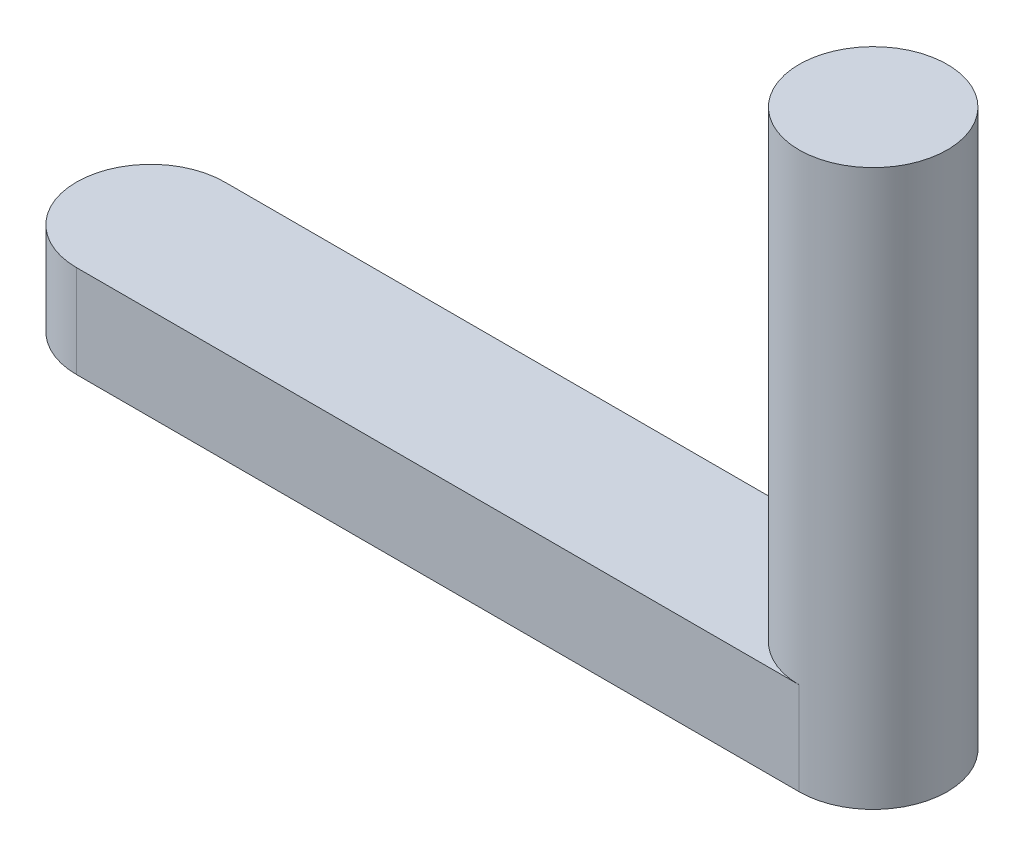
ISO-10303-21;
HEADER;
FILE_DESCRIPTION(('STEP AP214'),'2;1');
FILE_NAME('part.step','',(''),(''),'','','');
FILE_SCHEMA(('AUTOMOTIVE_DESIGN { 1 0 10303 214 1 1 1 1 }'));
ENDSEC;
DATA;
#1=APPLICATION_CONTEXT('core data for automotive mechanical design processes');
#2=APPLICATION_PROTOCOL_DEFINITION('international standard','automotive_design',2000,#1);
#3=PRODUCT_CONTEXT('',#1,'mechanical');
#4=PRODUCT('Part','Part','',(#3));
#5=PRODUCT_RELATED_PRODUCT_CATEGORY('part','',(#4));
#6=PRODUCT_DEFINITION_FORMATION('','',#4);
#7=PRODUCT_DEFINITION_CONTEXT('part definition',#1,'design');
#8=PRODUCT_DEFINITION('design','',#6,#7);
#9=PRODUCT_DEFINITION_SHAPE('','',#8);
#10=(LENGTH_UNIT() NAMED_UNIT(*) SI_UNIT(.MILLI.,.METRE.));
#11=(NAMED_UNIT(*) PLANE_ANGLE_UNIT() SI_UNIT($,.RADIAN.));
#12=(NAMED_UNIT(*) SI_UNIT($,.STERADIAN.) SOLID_ANGLE_UNIT());
#13=UNCERTAINTY_MEASURE_WITH_UNIT(LENGTH_MEASURE(1.E-05),#10,'distance_accuracy_value','');
#14=(GEOMETRIC_REPRESENTATION_CONTEXT(3) GLOBAL_UNCERTAINTY_ASSIGNED_CONTEXT((#13)) GLOBAL_UNIT_ASSIGNED_CONTEXT((#10,
#11,#12)) REPRESENTATION_CONTEXT('',''));
#15=CARTESIAN_POINT('',(0.,0.,0.));
#16=DIRECTION('',(0.,0.,1.));
#17=DIRECTION('',(1.,0.,0.));
#18=AXIS2_PLACEMENT_3D('',#15,#16,#17);
#19=CARTESIAN_POINT('',(0.,5.,4.));
#20=DIRECTION('',(0.,1.,0.));
#21=DIRECTION('',(0.,0.,1.));
#22=AXIS2_PLACEMENT_3D('',#19,#20,#21);
#23=PLANE('',#22);
#24=DIRECTION('',(1.,0.,0.));
#25=VECTOR('',#24,1.);
#26=CARTESIAN_POINT('',(1.81795211913818E-07,5.,8.));
#27=LINE('',#26,#25);
#28=CARTESIAN_POINT('',(1.81795211913818E-07,5.,8.));
#29=VERTEX_POINT('',#28);
#30=CARTESIAN_POINT('',(39.0000001817957,5.,8.));
#31=VERTEX_POINT('',#30);
#32=EDGE_CURVE('E92',#29,#31,#27,.T.);
#33=ORIENTED_EDGE('',*,*,#32,.T.);
#34=CARTESIAN_POINT('',(39.0000001817957,5.,4.));
#35=DIRECTION('',(0.,1.,0.));
#36=DIRECTION('',(0.,0.,1.));
#37=AXIS2_PLACEMENT_3D('',#34,#35,#36);
#38=CIRCLE('',#37,4.00000000000001);
#39=CARTESIAN_POINT('',(39.0000000000004,5.,0.));
#40=VERTEX_POINT('',#39);
#41=EDGE_CURVE('E103',#31,#40,#38,.F.);
#42=ORIENTED_EDGE('',*,*,#41,.T.);
#43=DIRECTION('',(-1.,0.,0.));
#44=VECTOR('',#43,1.);
#45=CARTESIAN_POINT('',(0.,5.,0.));
#46=LINE('',#45,#44);
#47=CARTESIAN_POINT('',(0.,5.,0.));
#48=VERTEX_POINT('',#47);
#49=EDGE_CURVE('E63',#40,#48,#46,.T.);
#50=ORIENTED_EDGE('',*,*,#49,.T.);
#51=CARTESIAN_POINT('',(0.,5.,4.));
#52=DIRECTION('',(0.,1.,0.));
#53=DIRECTION('',(0.,0.,1.));
#54=AXIS2_PLACEMENT_3D('',#51,#52,#53);
#55=CIRCLE('',#54,4.);
#56=EDGE_CURVE('E122',#48,#29,#55,.T.);
#57=ORIENTED_EDGE('',*,*,#56,.T.);
#58=EDGE_LOOP('',(#33,#42,#50,#57));
#59=FACE_BOUND('',#58,.T.);
#60=ADVANCED_FACE('F45',(#59),#23,.T.);
#61=CARTESIAN_POINT('',(0.,5.,4.));
#62=DIRECTION('',(0.,-1.,0.));
#63=DIRECTION('',(0.,0.,-1.));
#64=AXIS2_PLACEMENT_3D('',#61,#62,#63);
#65=CYLINDRICAL_SURFACE('',#64,4.);
#66=CARTESIAN_POINT('',(0.,0.,4.));
#67=DIRECTION('',(0.,1.,0.));
#68=DIRECTION('',(0.,0.,1.));
#69=AXIS2_PLACEMENT_3D('',#66,#67,#68);
#70=CIRCLE('',#69,4.);
#71=CARTESIAN_POINT('',(0.,0.,0.));
#72=VERTEX_POINT('',#71);
#73=CARTESIAN_POINT('',(1.81795211913818E-07,0.,8.));
#74=VERTEX_POINT('',#73);
#75=EDGE_CURVE('E120',#72,#74,#70,.T.);
#76=ORIENTED_EDGE('',*,*,#75,.T.);
#77=DIRECTION('',(0.,-1.,0.));
#78=VECTOR('',#77,1.);
#79=CARTESIAN_POINT('',(1.81795211913818E-07,5.,8.));
#80=LINE('',#79,#78);
#81=EDGE_CURVE('E11',#29,#74,#80,.T.);
#82=ORIENTED_EDGE('',*,*,#81,.F.);
#83=ORIENTED_EDGE('',*,*,#56,.F.);
#84=DIRECTION('',(0.,-1.,0.));
#85=VECTOR('',#84,1.);
#86=CARTESIAN_POINT('',(0.,5.,0.));
#87=LINE('',#86,#85);
#88=EDGE_CURVE('E96',#48,#72,#87,.T.);
#89=ORIENTED_EDGE('',*,*,#88,.T.);
#90=EDGE_LOOP('',(#76,#82,#83,#89));
#91=FACE_BOUND('',#90,.T.);
#92=ADVANCED_FACE('F47',(#91),#65,.T.);
#93=CARTESIAN_POINT('',(1.81795211913818E-07,5.,8.));
#94=DIRECTION('',(0.,0.,-1.));
#95=DIRECTION('',(-1.,0.,0.));
#96=AXIS2_PLACEMENT_3D('',#93,#94,#95);
#97=PLANE('',#96);
#98=DIRECTION('',(1.,0.,0.));
#99=VECTOR('',#98,1.);
#100=CARTESIAN_POINT('',(1.81795211913818E-07,0.,8.));
#101=LINE('',#100,#99);
#102=CARTESIAN_POINT('',(39.0000001817957,0.,8.));
#103=VERTEX_POINT('',#102);
#104=EDGE_CURVE('E130',#74,#103,#101,.T.);
#105=ORIENTED_EDGE('',*,*,#104,.T.);
#106=DIRECTION('',(0.,-1.,0.));
#107=VECTOR('',#106,1.);
#108=CARTESIAN_POINT('',(39.0000001817957,5.,8.));
#109=LINE('',#108,#107);
#110=EDGE_CURVE('E55',#31,#103,#109,.T.);
#111=ORIENTED_EDGE('',*,*,#110,.F.);
#112=ORIENTED_EDGE('',*,*,#32,.F.);
#113=ORIENTED_EDGE('',*,*,#81,.T.);
#114=EDGE_LOOP('',(#105,#111,#112,#113));
#115=FACE_BOUND('',#114,.T.);
#116=ADVANCED_FACE('F145',(#115),#97,.F.);
#117=CARTESIAN_POINT('',(39.0000001817957,5.,4.));
#118=DIRECTION('',(0.,-1.,0.));
#119=DIRECTION('',(0.,0.,-1.));
#120=AXIS2_PLACEMENT_3D('',#117,#118,#119);
#121=CYLINDRICAL_SURFACE('',#120,4.);
#122=CARTESIAN_POINT('',(39.0000001817957,0.,4.));
#123=DIRECTION('',(0.,1.,0.));
#124=DIRECTION('',(0.,0.,1.));
#125=AXIS2_PLACEMENT_3D('',#122,#123,#124);
#126=CIRCLE('',#125,4.);
#127=CARTESIAN_POINT('',(39.0000000000004,0.,0.));
#128=VERTEX_POINT('',#127);
#129=EDGE_CURVE('E82',#103,#128,#126,.T.);
#130=ORIENTED_EDGE('',*,*,#129,.T.);
#131=DIRECTION('',(0.,-1.,0.));
#132=VECTOR('',#131,1.);
#133=CARTESIAN_POINT('',(39.0000000000004,5.,0.));
#134=LINE('',#133,#132);
#135=EDGE_CURVE('E95',#40,#128,#134,.T.);
#136=ORIENTED_EDGE('',*,*,#135,.F.);
#137=ORIENTED_EDGE('',*,*,#41,.F.);
#138=ORIENTED_EDGE('',*,*,#110,.T.);
#139=EDGE_LOOP('',(#130,#136,#137,#138));
#140=FACE_BOUND('',#139,.T.);
#141=CARTESIAN_POINT('',(39.0000001817957,30.,4.));
#142=DIRECTION('',(0.,1.,0.));
#143=DIRECTION('',(0.,0.,1.));
#144=AXIS2_PLACEMENT_3D('',#141,#142,#143);
#145=CIRCLE('',#144,4.00000000000001);
#146=CARTESIAN_POINT('',(39.0000001817957,30.,8.00000000000001));
#147=VERTEX_POINT('',#146);
#148=EDGE_CURVE('E108',#147,#147,#145,.T.);
#149=ORIENTED_EDGE('',*,*,#148,.F.);
#150=EDGE_LOOP('',(#149));
#151=FACE_BOUND('',#150,.T.);
#152=ADVANCED_FACE('F101',(#140,#151),#121,.T.);
#153=CARTESIAN_POINT('',(0.,5.,0.));
#154=DIRECTION('',(0.,0.,1.));
#155=DIRECTION('',(1.,0.,0.));
#156=AXIS2_PLACEMENT_3D('',#153,#154,#155);
#157=PLANE('',#156);
#158=DIRECTION('',(-1.,0.,0.));
#159=VECTOR('',#158,1.);
#160=CARTESIAN_POINT('',(0.,0.,0.));
#161=LINE('',#160,#159);
#162=EDGE_CURVE('E87',#128,#72,#161,.T.);
#163=ORIENTED_EDGE('',*,*,#162,.T.);
#164=ORIENTED_EDGE('',*,*,#88,.F.);
#165=ORIENTED_EDGE('',*,*,#49,.F.);
#166=ORIENTED_EDGE('',*,*,#135,.T.);
#167=EDGE_LOOP('',(#163,#164,#165,#166));
#168=FACE_BOUND('',#167,.T.);
#169=ADVANCED_FACE('F94',(#168),#157,.F.);
#170=CARTESIAN_POINT('',(0.,0.,4.));
#171=DIRECTION('',(0.,1.,0.));
#172=DIRECTION('',(0.,0.,1.));
#173=AXIS2_PLACEMENT_3D('',#170,#171,#172);
#174=PLANE('',#173);
#175=ORIENTED_EDGE('',*,*,#129,.F.);
#176=ORIENTED_EDGE('',*,*,#104,.F.);
#177=ORIENTED_EDGE('',*,*,#75,.F.);
#178=ORIENTED_EDGE('',*,*,#162,.F.);
#179=EDGE_LOOP('',(#175,#176,#177,#178));
#180=FACE_BOUND('',#179,.T.);
#181=CARTESIAN_POINT('',(0.,0.,4.));
#182=DIRECTION('',(0.,1.,0.));
#183=DIRECTION('',(0.,0.,1.));
#184=AXIS2_PLACEMENT_3D('',#181,#182,#183);
#185=CIRCLE('',#184,2.525);
#186=CARTESIAN_POINT('',(0.,0.,6.525));
#187=VERTEX_POINT('',#186);
#188=EDGE_CURVE('E107',#187,#187,#185,.T.);
#189=ORIENTED_EDGE('',*,*,#188,.T.);
#190=EDGE_LOOP('',(#189));
#191=FACE_BOUND('',#190,.T.);
#192=ADVANCED_FACE('F140',(#180,#191),#174,.F.);
#193=CARTESIAN_POINT('',(0.,2.,4.));
#194=DIRECTION('',(0.,-1.,0.));
#195=DIRECTION('',(0.,0.,-1.));
#196=AXIS2_PLACEMENT_3D('',#193,#194,#195);
#197=CYLINDRICAL_SURFACE('',#196,2.525);
#198=CARTESIAN_POINT('',(0.,2.,4.));
#199=DIRECTION('',(0.,1.,0.));
#200=DIRECTION('',(0.,0.,1.));
#201=AXIS2_PLACEMENT_3D('',#198,#199,#200);
#202=CIRCLE('',#201,2.525);
#203=CARTESIAN_POINT('',(0.,2.,6.525));
#204=VERTEX_POINT('',#203);
#205=EDGE_CURVE('E113',#204,#204,#202,.T.);
#206=ORIENTED_EDGE('',*,*,#205,.T.);
#207=EDGE_LOOP('',(#206));
#208=FACE_BOUND('',#207,.T.);
#209=ORIENTED_EDGE('',*,*,#188,.F.);
#210=EDGE_LOOP('',(#209));
#211=FACE_BOUND('',#210,.T.);
#212=ADVANCED_FACE('F159',(#208,#211),#197,.F.);
#213=CARTESIAN_POINT('',(0.,2.,4.));
#214=DIRECTION('',(0.,1.,0.));
#215=DIRECTION('',(0.,0.,1.));
#216=AXIS2_PLACEMENT_3D('',#213,#214,#215);
#217=PLANE('',#216);
#218=ORIENTED_EDGE('',*,*,#205,.F.);
#219=EDGE_LOOP('',(#218));
#220=FACE_BOUND('',#219,.T.);
#221=ADVANCED_FACE('F176',(#220),#217,.F.);
#222=CARTESIAN_POINT('',(39.0000001817957,30.,4.));
#223=DIRECTION('',(0.,1.,0.));
#224=DIRECTION('',(0.,0.,1.));
#225=AXIS2_PLACEMENT_3D('',#222,#223,#224);
#226=PLANE('',#225);
#227=ORIENTED_EDGE('',*,*,#148,.T.);
#228=EDGE_LOOP('',(#227));
#229=FACE_BOUND('',#228,.T.);
#230=ADVANCED_FACE('F183',(#229),#226,.T.);
#231=CLOSED_SHELL('',(#60,#92,#116,#152,#169,#192,#212,#221,#230));
#232=MANIFOLD_SOLID_BREP('B2',#231);
#233=ADVANCED_BREP_SHAPE_REPRESENTATION('',(#18,#232),#14);
#234=SHAPE_DEFINITION_REPRESENTATION(#9,#233);
ENDSEC;
END-ISO-10303-21;
